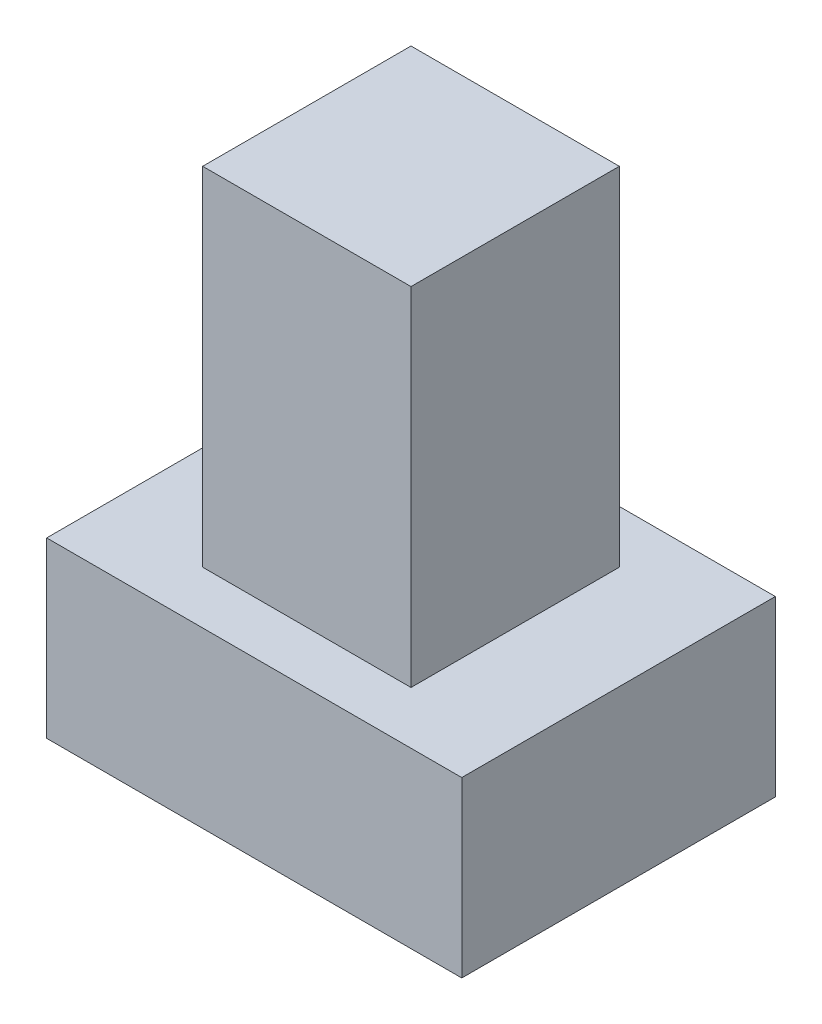
ISO-10303-21;
HEADER;
FILE_DESCRIPTION(('STEP AP214'),'2;1');
FILE_NAME('part.step','',(''),(''),'','','');
FILE_SCHEMA(('AUTOMOTIVE_DESIGN { 1 0 10303 214 1 1 1 1 }'));
ENDSEC;
DATA;
#1=APPLICATION_CONTEXT('core data for automotive mechanical design processes');
#2=APPLICATION_PROTOCOL_DEFINITION('international standard','automotive_design',2000,#1);
#3=PRODUCT_CONTEXT('',#1,'mechanical');
#4=PRODUCT('Part','Part','',(#3));
#5=PRODUCT_RELATED_PRODUCT_CATEGORY('part','',(#4));
#6=PRODUCT_DEFINITION_FORMATION('','',#4);
#7=PRODUCT_DEFINITION_CONTEXT('part definition',#1,'design');
#8=PRODUCT_DEFINITION('design','',#6,#7);
#9=PRODUCT_DEFINITION_SHAPE('','',#8);
#10=(LENGTH_UNIT() NAMED_UNIT(*) SI_UNIT(.MILLI.,.METRE.));
#11=(NAMED_UNIT(*) PLANE_ANGLE_UNIT() SI_UNIT($,.RADIAN.));
#12=(NAMED_UNIT(*) SI_UNIT($,.STERADIAN.) SOLID_ANGLE_UNIT());
#13=UNCERTAINTY_MEASURE_WITH_UNIT(LENGTH_MEASURE(1.E-05),#10,'distance_accuracy_value','');
#14=(GEOMETRIC_REPRESENTATION_CONTEXT(3) GLOBAL_UNCERTAINTY_ASSIGNED_CONTEXT((#13)) GLOBAL_UNIT_ASSIGNED_CONTEXT((#10,
#11,#12)) REPRESENTATION_CONTEXT('',''));
#15=CARTESIAN_POINT('',(0.,0.,0.));
#16=DIRECTION('',(0.,0.,1.));
#17=DIRECTION('',(1.,0.,0.));
#18=AXIS2_PLACEMENT_3D('',#15,#16,#17);
#19=CARTESIAN_POINT('',(0.,5.,0.));
#20=DIRECTION('',(0.,-1.,0.));
#21=DIRECTION('',(0.,0.,-1.));
#22=AXIS2_PLACEMENT_3D('',#19,#20,#21);
#23=PLANE('',#22);
#24=DIRECTION('',(0.,0.,1.));
#25=VECTOR('',#24,1.);
#26=CARTESIAN_POINT('',(0.,5.,0.));
#27=LINE('',#26,#25);
#28=CARTESIAN_POINT('',(0.,5.,-9.03081317625994));
#29=VERTEX_POINT('',#28);
#30=CARTESIAN_POINT('',(0.,5.,0.));
#31=VERTEX_POINT('',#30);
#32=EDGE_CURVE('E130',#29,#31,#27,.T.);
#33=ORIENTED_EDGE('',*,*,#32,.T.);
#34=DIRECTION('',(1.,0.,0.));
#35=VECTOR('',#34,1.);
#36=CARTESIAN_POINT('',(0.,5.,0.));
#37=LINE('',#36,#35);
#38=CARTESIAN_POINT('',(11.9544361207986,5.,0.));
#39=VERTEX_POINT('',#38);
#40=EDGE_CURVE('E133',#31,#39,#37,.T.);
#41=ORIENTED_EDGE('',*,*,#40,.T.);
#42=DIRECTION('',(0.,0.,-1.));
#43=VECTOR('',#42,1.);
#44=CARTESIAN_POINT('',(11.9544361207986,5.,0.));
#45=LINE('',#44,#43);
#46=CARTESIAN_POINT('',(11.9544361207986,5.,-9.03081317625994));
#47=VERTEX_POINT('',#46);
#48=EDGE_CURVE('E136',#39,#47,#45,.T.);
#49=ORIENTED_EDGE('',*,*,#48,.T.);
#50=DIRECTION('',(-1.,0.,0.));
#51=VECTOR('',#50,1.);
#52=CARTESIAN_POINT('',(0.,5.,-9.03081317625994));
#53=LINE('',#52,#51);
#54=EDGE_CURVE('E138',#47,#29,#53,.T.);
#55=ORIENTED_EDGE('',*,*,#54,.T.);
#56=EDGE_LOOP('',(#33,#41,#49,#55));
#57=FACE_BOUND('',#56,.T.);
#58=DIRECTION('',(0.,0.,-1.));
#59=VECTOR('',#58,1.);
#60=CARTESIAN_POINT('',(8.97721806039929,5.,-7.51540658812997));
#61=LINE('',#60,#59);
#62=CARTESIAN_POINT('',(8.97721806039929,5.,-1.51540658812997));
#63=VERTEX_POINT('',#62);
#64=CARTESIAN_POINT('',(8.97721806039929,5.,-7.51540658812997));
#65=VERTEX_POINT('',#64);
#66=EDGE_CURVE('E120',#63,#65,#61,.T.);
#67=ORIENTED_EDGE('',*,*,#66,.F.);
#68=DIRECTION('',(1.,0.,0.));
#69=VECTOR('',#68,1.);
#70=CARTESIAN_POINT('',(2.97721806039929,5.,-1.51540658812997));
#71=LINE('',#70,#69);
#72=CARTESIAN_POINT('',(2.97721806039929,5.,-1.51540658812997));
#73=VERTEX_POINT('',#72);
#74=EDGE_CURVE('E117',#73,#63,#71,.T.);
#75=ORIENTED_EDGE('',*,*,#74,.F.);
#76=DIRECTION('',(0.,0.,1.));
#77=VECTOR('',#76,1.);
#78=CARTESIAN_POINT('',(2.97721806039929,5.,-7.51540658812997));
#79=LINE('',#78,#77);
#80=CARTESIAN_POINT('',(2.97721806039929,5.,-7.51540658812997));
#81=VERTEX_POINT('',#80);
#82=EDGE_CURVE('E55',#81,#73,#79,.T.);
#83=ORIENTED_EDGE('',*,*,#82,.F.);
#84=DIRECTION('',(-1.,0.,0.));
#85=VECTOR('',#84,1.);
#86=CARTESIAN_POINT('',(2.97721806039929,5.,-7.51540658812997));
#87=LINE('',#86,#85);
#88=EDGE_CURVE('E50',#65,#81,#87,.T.);
#89=ORIENTED_EDGE('',*,*,#88,.F.);
#90=EDGE_LOOP('',(#67,#75,#83,#89));
#91=FACE_BOUND('',#90,.T.);
#92=ADVANCED_FACE('F35',(#57,#91),#23,.F.);
#93=CARTESIAN_POINT('',(0.,5.,0.));
#94=DIRECTION('',(1.,0.,0.));
#95=DIRECTION('',(0.,0.,-1.));
#96=AXIS2_PLACEMENT_3D('',#93,#94,#95);
#97=PLANE('',#96);
#98=DIRECTION('',(0.,0.,1.));
#99=VECTOR('',#98,1.);
#100=CARTESIAN_POINT('',(0.,0.,0.));
#101=LINE('',#100,#99);
#102=CARTESIAN_POINT('',(0.,0.,-9.03081317625994));
#103=VERTEX_POINT('',#102);
#104=CARTESIAN_POINT('',(0.,0.,0.));
#105=VERTEX_POINT('',#104);
#106=EDGE_CURVE('E121',#103,#105,#101,.T.);
#107=ORIENTED_EDGE('',*,*,#106,.T.);
#108=DIRECTION('',(0.,-1.,0.));
#109=VECTOR('',#108,1.);
#110=CARTESIAN_POINT('',(0.,5.,0.));
#111=LINE('',#110,#109);
#112=EDGE_CURVE('E11',#31,#105,#111,.T.);
#113=ORIENTED_EDGE('',*,*,#112,.F.);
#114=ORIENTED_EDGE('',*,*,#32,.F.);
#115=DIRECTION('',(0.,-1.,0.));
#116=VECTOR('',#115,1.);
#117=CARTESIAN_POINT('',(0.,5.,-9.03081317625994));
#118=LINE('',#117,#116);
#119=EDGE_CURVE('E139',#29,#103,#118,.T.);
#120=ORIENTED_EDGE('',*,*,#119,.T.);
#121=EDGE_LOOP('',(#107,#113,#114,#120));
#122=FACE_BOUND('',#121,.T.);
#123=ADVANCED_FACE('F37',(#122),#97,.F.);
#124=CARTESIAN_POINT('',(0.,5.,0.));
#125=DIRECTION('',(0.,0.,-1.));
#126=DIRECTION('',(-1.,0.,0.));
#127=AXIS2_PLACEMENT_3D('',#124,#125,#126);
#128=PLANE('',#127);
#129=DIRECTION('',(1.,0.,0.));
#130=VECTOR('',#129,1.);
#131=CARTESIAN_POINT('',(0.,0.,0.));
#132=LINE('',#131,#130);
#133=CARTESIAN_POINT('',(11.9544361207986,0.,0.));
#134=VERTEX_POINT('',#133);
#135=EDGE_CURVE('E124',#105,#134,#132,.T.);
#136=ORIENTED_EDGE('',*,*,#135,.T.);
#137=DIRECTION('',(0.,-1.,0.));
#138=VECTOR('',#137,1.);
#139=CARTESIAN_POINT('',(11.9544361207986,5.,0.));
#140=LINE('',#139,#138);
#141=EDGE_CURVE('E43',#39,#134,#140,.T.);
#142=ORIENTED_EDGE('',*,*,#141,.F.);
#143=ORIENTED_EDGE('',*,*,#40,.F.);
#144=ORIENTED_EDGE('',*,*,#112,.T.);
#145=EDGE_LOOP('',(#136,#142,#143,#144));
#146=FACE_BOUND('',#145,.T.);
#147=ADVANCED_FACE('F169',(#146),#128,.F.);
#148=CARTESIAN_POINT('',(11.9544361207986,5.,0.));
#149=DIRECTION('',(-1.,0.,0.));
#150=DIRECTION('',(0.,0.,1.));
#151=AXIS2_PLACEMENT_3D('',#148,#149,#150);
#152=PLANE('',#151);
#153=DIRECTION('',(0.,0.,-1.));
#154=VECTOR('',#153,1.);
#155=CARTESIAN_POINT('',(11.9544361207986,0.,0.));
#156=LINE('',#155,#154);
#157=CARTESIAN_POINT('',(11.9544361207986,0.,-9.03081317625994));
#158=VERTEX_POINT('',#157);
#159=EDGE_CURVE('E142',#134,#158,#156,.T.);
#160=ORIENTED_EDGE('',*,*,#159,.T.);
#161=DIRECTION('',(0.,-1.,0.));
#162=VECTOR('',#161,1.);
#163=CARTESIAN_POINT('',(11.9544361207986,5.,-9.03081317625994));
#164=LINE('',#163,#162);
#165=EDGE_CURVE('E147',#47,#158,#164,.T.);
#166=ORIENTED_EDGE('',*,*,#165,.F.);
#167=ORIENTED_EDGE('',*,*,#48,.F.);
#168=ORIENTED_EDGE('',*,*,#141,.T.);
#169=EDGE_LOOP('',(#160,#166,#167,#168));
#170=FACE_BOUND('',#169,.T.);
#171=ADVANCED_FACE('F154',(#170),#152,.F.);
#172=CARTESIAN_POINT('',(0.,5.,-9.03081317625994));
#173=DIRECTION('',(0.,0.,1.));
#174=DIRECTION('',(1.,0.,0.));
#175=AXIS2_PLACEMENT_3D('',#172,#173,#174);
#176=PLANE('',#175);
#177=DIRECTION('',(-1.,0.,0.));
#178=VECTOR('',#177,1.);
#179=CARTESIAN_POINT('',(0.,0.,-9.03081317625994));
#180=LINE('',#179,#178);
#181=EDGE_CURVE('E134',#158,#103,#180,.T.);
#182=ORIENTED_EDGE('',*,*,#181,.T.);
#183=ORIENTED_EDGE('',*,*,#119,.F.);
#184=ORIENTED_EDGE('',*,*,#54,.F.);
#185=ORIENTED_EDGE('',*,*,#165,.T.);
#186=EDGE_LOOP('',(#182,#183,#184,#185));
#187=FACE_BOUND('',#186,.T.);
#188=ADVANCED_FACE('F163',(#187),#176,.F.);
#189=CARTESIAN_POINT('',(0.,0.,0.));
#190=DIRECTION('',(0.,-1.,0.));
#191=DIRECTION('',(0.,0.,-1.));
#192=AXIS2_PLACEMENT_3D('',#189,#190,#191);
#193=PLANE('',#192);
#194=ORIENTED_EDGE('',*,*,#106,.F.);
#195=ORIENTED_EDGE('',*,*,#181,.F.);
#196=ORIENTED_EDGE('',*,*,#159,.F.);
#197=ORIENTED_EDGE('',*,*,#135,.F.);
#198=EDGE_LOOP('',(#194,#195,#196,#197));
#199=FACE_BOUND('',#198,.T.);
#200=ADVANCED_FACE('F160',(#199),#193,.T.);
#201=CARTESIAN_POINT('',(8.97721806039929,15.,-7.51540658812997));
#202=DIRECTION('',(-1.,0.,0.));
#203=DIRECTION('',(0.,0.,1.));
#204=AXIS2_PLACEMENT_3D('',#201,#202,#203);
#205=PLANE('',#204);
#206=ORIENTED_EDGE('',*,*,#66,.T.);
#207=DIRECTION('',(0.,-1.,0.));
#208=VECTOR('',#207,1.);
#209=CARTESIAN_POINT('',(8.97721806039929,15.,-7.51540658812997));
#210=LINE('',#209,#208);
#211=CARTESIAN_POINT('',(8.97721806039929,15.,-7.51540658812997));
#212=VERTEX_POINT('',#211);
#213=EDGE_CURVE('E101',#212,#65,#210,.T.);
#214=ORIENTED_EDGE('',*,*,#213,.F.);
#215=DIRECTION('',(0.,0.,-1.));
#216=VECTOR('',#215,1.);
#217=CARTESIAN_POINT('',(8.97721806039929,15.,-7.51540658812997));
#218=LINE('',#217,#216);
#219=CARTESIAN_POINT('',(8.97721806039929,15.,-1.51540658812997));
#220=VERTEX_POINT('',#219);
#221=EDGE_CURVE('E108',#220,#212,#218,.T.);
#222=ORIENTED_EDGE('',*,*,#221,.F.);
#223=DIRECTION('',(0.,-1.,0.));
#224=VECTOR('',#223,1.);
#225=CARTESIAN_POINT('',(8.97721806039929,15.,-1.51540658812997));
#226=LINE('',#225,#224);
#227=EDGE_CURVE('E262',#220,#63,#226,.T.);
#228=ORIENTED_EDGE('',*,*,#227,.T.);
#229=EDGE_LOOP('',(#206,#214,#222,#228));
#230=FACE_BOUND('',#229,.T.);
#231=ADVANCED_FACE('F119',(#230),#205,.F.);
#232=CARTESIAN_POINT('',(2.97721806039929,15.,-7.51540658812997));
#233=DIRECTION('',(0.,0.,1.));
#234=DIRECTION('',(1.,0.,0.));
#235=AXIS2_PLACEMENT_3D('',#232,#233,#234);
#236=PLANE('',#235);
#237=ORIENTED_EDGE('',*,*,#88,.T.);
#238=DIRECTION('',(0.,-1.,0.));
#239=VECTOR('',#238,1.);
#240=CARTESIAN_POINT('',(2.97721806039929,15.,-7.51540658812997));
#241=LINE('',#240,#239);
#242=CARTESIAN_POINT('',(2.97721806039929,15.,-7.51540658812997));
#243=VERTEX_POINT('',#242);
#244=EDGE_CURVE('E104',#243,#81,#241,.T.);
#245=ORIENTED_EDGE('',*,*,#244,.F.);
#246=DIRECTION('',(-1.,0.,0.));
#247=VECTOR('',#246,1.);
#248=CARTESIAN_POINT('',(2.97721806039929,15.,-7.51540658812997));
#249=LINE('',#248,#247);
#250=EDGE_CURVE('E97',#212,#243,#249,.T.);
#251=ORIENTED_EDGE('',*,*,#250,.F.);
#252=ORIENTED_EDGE('',*,*,#213,.T.);
#253=EDGE_LOOP('',(#237,#245,#251,#252));
#254=FACE_BOUND('',#253,.T.);
#255=ADVANCED_FACE('F99',(#254),#236,.F.);
#256=CARTESIAN_POINT('',(2.97721806039929,15.,-7.51540658812997));
#257=DIRECTION('',(1.,0.,0.));
#258=DIRECTION('',(0.,0.,-1.));
#259=AXIS2_PLACEMENT_3D('',#256,#257,#258);
#260=PLANE('',#259);
#261=ORIENTED_EDGE('',*,*,#82,.T.);
#262=DIRECTION('',(0.,-1.,0.));
#263=VECTOR('',#262,1.);
#264=CARTESIAN_POINT('',(2.97721806039929,15.,-1.51540658812997));
#265=LINE('',#264,#263);
#266=CARTESIAN_POINT('',(2.97721806039929,15.,-1.51540658812997));
#267=VERTEX_POINT('',#266);
#268=EDGE_CURVE('E126',#267,#73,#265,.T.);
#269=ORIENTED_EDGE('',*,*,#268,.F.);
#270=DIRECTION('',(0.,0.,1.));
#271=VECTOR('',#270,1.);
#272=CARTESIAN_POINT('',(2.97721806039929,15.,-7.51540658812997));
#273=LINE('',#272,#271);
#274=EDGE_CURVE('E107',#243,#267,#273,.T.);
#275=ORIENTED_EDGE('',*,*,#274,.F.);
#276=ORIENTED_EDGE('',*,*,#244,.T.);
#277=EDGE_LOOP('',(#261,#269,#275,#276));
#278=FACE_BOUND('',#277,.T.);
#279=ADVANCED_FACE('F205',(#278),#260,.F.);
#280=CARTESIAN_POINT('',(2.97721806039929,15.,-1.51540658812997));
#281=DIRECTION('',(0.,0.,-1.));
#282=DIRECTION('',(-1.,0.,0.));
#283=AXIS2_PLACEMENT_3D('',#280,#281,#282);
#284=PLANE('',#283);
#285=ORIENTED_EDGE('',*,*,#74,.T.);
#286=ORIENTED_EDGE('',*,*,#227,.F.);
#287=DIRECTION('',(1.,0.,0.));
#288=VECTOR('',#287,1.);
#289=CARTESIAN_POINT('',(2.97721806039929,15.,-1.51540658812997));
#290=LINE('',#289,#288);
#291=EDGE_CURVE('E113',#267,#220,#290,.T.);
#292=ORIENTED_EDGE('',*,*,#291,.F.);
#293=ORIENTED_EDGE('',*,*,#268,.T.);
#294=EDGE_LOOP('',(#285,#286,#292,#293));
#295=FACE_BOUND('',#294,.T.);
#296=ADVANCED_FACE('F211',(#295),#284,.F.);
#297=CARTESIAN_POINT('',(0.,15.,0.));
#298=DIRECTION('',(0.,1.,0.));
#299=DIRECTION('',(0.,0.,1.));
#300=AXIS2_PLACEMENT_3D('',#297,#298,#299);
#301=PLANE('',#300);
#302=ORIENTED_EDGE('',*,*,#221,.T.);
#303=ORIENTED_EDGE('',*,*,#250,.T.);
#304=ORIENTED_EDGE('',*,*,#274,.T.);
#305=ORIENTED_EDGE('',*,*,#291,.T.);
#306=EDGE_LOOP('',(#302,#303,#304,#305));
#307=FACE_BOUND('',#306,.T.);
#308=ADVANCED_FACE('F111',(#307),#301,.T.);
#309=CLOSED_SHELL('',(#92,#123,#147,#171,#188,#200,#231,#255,#279,#296,#308));
#310=MANIFOLD_SOLID_BREP('B2',#309);
#311=ADVANCED_BREP_SHAPE_REPRESENTATION('',(#18,#310),#14);
#312=SHAPE_DEFINITION_REPRESENTATION(#9,#311);
ENDSEC;
END-ISO-10303-21;
